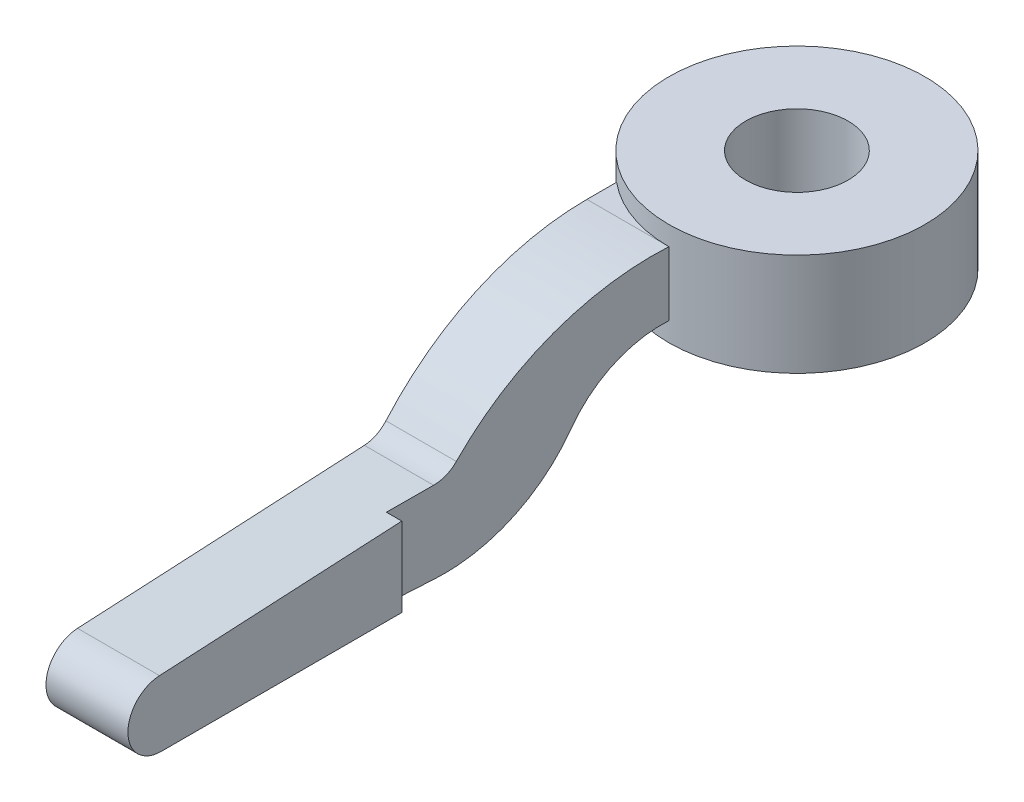
ISO-10303-21;
HEADER;
FILE_DESCRIPTION(('STEP AP214'),'2;1');
FILE_NAME('part.step','',(''),(''),'','','');
FILE_SCHEMA(('AUTOMOTIVE_DESIGN { 1 0 10303 214 1 1 1 1 }'));
ENDSEC;
DATA;
#1=APPLICATION_CONTEXT('core data for automotive mechanical design processes');
#2=APPLICATION_PROTOCOL_DEFINITION('international standard','automotive_design',2000,#1);
#3=PRODUCT_CONTEXT('',#1,'mechanical');
#4=PRODUCT('Part','Part','',(#3));
#5=PRODUCT_RELATED_PRODUCT_CATEGORY('part','',(#4));
#6=PRODUCT_DEFINITION_FORMATION('','',#4);
#7=PRODUCT_DEFINITION_CONTEXT('part definition',#1,'design');
#8=PRODUCT_DEFINITION('design','',#6,#7);
#9=PRODUCT_DEFINITION_SHAPE('','',#8);
#10=(LENGTH_UNIT() NAMED_UNIT(*) SI_UNIT(.MILLI.,.METRE.));
#11=(NAMED_UNIT(*) PLANE_ANGLE_UNIT() SI_UNIT($,.RADIAN.));
#12=(NAMED_UNIT(*) SI_UNIT($,.STERADIAN.) SOLID_ANGLE_UNIT());
#13=UNCERTAINTY_MEASURE_WITH_UNIT(LENGTH_MEASURE(1.E-05),#10,'distance_accuracy_value','');
#14=(GEOMETRIC_REPRESENTATION_CONTEXT(3) GLOBAL_UNCERTAINTY_ASSIGNED_CONTEXT((#13)) GLOBAL_UNIT_ASSIGNED_CONTEXT((#10,
#11,#12)) REPRESENTATION_CONTEXT('',''));
#15=CARTESIAN_POINT('',(0.,0.,0.));
#16=DIRECTION('',(0.,0.,1.));
#17=DIRECTION('',(1.,0.,0.));
#18=AXIS2_PLACEMENT_3D('',#15,#16,#17);
#19=CARTESIAN_POINT('',(0.,2.,0.));
#20=DIRECTION('',(0.,-1.,0.));
#21=DIRECTION('',(0.,0.,-1.));
#22=AXIS2_PLACEMENT_3D('',#19,#20,#21);
#23=CYLINDRICAL_SURFACE('',#22,2.5);
#24=DIRECTION('',(0.,-1.,0.));
#25=VECTOR('',#24,1.);
#26=CARTESIAN_POINT('',(0.,2.,2.5));
#27=LINE('',#26,#25);
#28=CARTESIAN_POINT('',(0.,1.625,2.5));
#29=VERTEX_POINT('',#28);
#30=CARTESIAN_POINT('',(0.,0.375,2.5));
#31=VERTEX_POINT('',#30);
#32=EDGE_CURVE('E190',#29,#31,#27,.T.);
#33=ORIENTED_EDGE('',*,*,#32,.T.);
#34=CARTESIAN_POINT('',(0.,0.375,0.));
#35=DIRECTION('',(0.,1.,0.));
#36=DIRECTION('',(-1.,0.,0.));
#37=AXIS2_PLACEMENT_3D('',#34,#35,#36);
#38=CIRCLE('',#37,2.5);
#39=CARTESIAN_POINT('',(-1.6,0.375,1.92093727122986));
#40=VERTEX_POINT('',#39);
#41=EDGE_CURVE('E195',#40,#31,#38,.T.);
#42=ORIENTED_EDGE('',*,*,#41,.F.);
#43=DIRECTION('',(0.,-1.,0.));
#44=VECTOR('',#43,1.);
#45=CARTESIAN_POINT('',(-1.6,2.,1.92093727122986));
#46=LINE('',#45,#44);
#47=CARTESIAN_POINT('',(-1.6,1.625,1.92093727122986));
#48=VERTEX_POINT('',#47);
#49=EDGE_CURVE('E53',#48,#40,#46,.T.);
#50=ORIENTED_EDGE('',*,*,#49,.F.);
#51=CARTESIAN_POINT('',(0.,1.625,0.));
#52=DIRECTION('',(0.,-1.,0.));
#53=DIRECTION('',(1.,0.,0.));
#54=AXIS2_PLACEMENT_3D('',#51,#52,#53);
#55=CIRCLE('',#54,2.5);
#56=EDGE_CURVE('E61',#29,#48,#55,.T.);
#57=ORIENTED_EDGE('',*,*,#56,.F.);
#58=EDGE_LOOP('',(#33,#42,#50,#57));
#59=FACE_BOUND('',#58,.T.);
#60=CARTESIAN_POINT('',(0.,2.,0.));
#61=DIRECTION('',(0.,1.,0.));
#62=DIRECTION('',(0.,0.,1.));
#63=AXIS2_PLACEMENT_3D('',#60,#61,#62);
#64=CIRCLE('',#63,2.5);
#65=CARTESIAN_POINT('',(0.,2.,2.5));
#66=VERTEX_POINT('',#65);
#67=EDGE_CURVE('E187',#66,#66,#64,.T.);
#68=ORIENTED_EDGE('',*,*,#67,.F.);
#69=EDGE_LOOP('',(#68));
#70=FACE_BOUND('',#69,.T.);
#71=CARTESIAN_POINT('',(0.,0.,0.));
#72=DIRECTION('',(0.,1.,0.));
#73=DIRECTION('',(0.,0.,1.));
#74=AXIS2_PLACEMENT_3D('',#71,#72,#73);
#75=CIRCLE('',#74,2.5);
#76=CARTESIAN_POINT('',(0.,0.,2.5));
#77=VERTEX_POINT('',#76);
#78=EDGE_CURVE('E184',#77,#77,#75,.T.);
#79=ORIENTED_EDGE('',*,*,#78,.T.);
#80=EDGE_LOOP('',(#79));
#81=FACE_BOUND('',#80,.T.);
#82=ADVANCED_FACE('F39',(#59,#70,#81),#23,.T.);
#83=CARTESIAN_POINT('',(0.,2.,0.));
#84=DIRECTION('',(0.,1.,0.));
#85=DIRECTION('',(0.,0.,1.));
#86=AXIS2_PLACEMENT_3D('',#83,#84,#85);
#87=PLANE('',#86);
#88=ORIENTED_EDGE('',*,*,#67,.T.);
#89=EDGE_LOOP('',(#88));
#90=FACE_BOUND('',#89,.T.);
#91=CARTESIAN_POINT('',(0.,2.,0.));
#92=DIRECTION('',(0.,1.,0.));
#93=DIRECTION('',(0.,0.,1.));
#94=AXIS2_PLACEMENT_3D('',#91,#92,#93);
#95=CIRCLE('',#94,1.);
#96=CARTESIAN_POINT('',(0.,2.,1.));
#97=VERTEX_POINT('',#96);
#98=EDGE_CURVE('E181',#97,#97,#95,.T.);
#99=ORIENTED_EDGE('',*,*,#98,.F.);
#100=EDGE_LOOP('',(#99));
#101=FACE_BOUND('',#100,.T.);
#102=ADVANCED_FACE('F260',(#90,#101),#87,.T.);
#103=CARTESIAN_POINT('',(0.,0.,0.));
#104=DIRECTION('',(0.,1.,0.));
#105=DIRECTION('',(0.,0.,1.));
#106=AXIS2_PLACEMENT_3D('',#103,#104,#105);
#107=PLANE('',#106);
#108=ORIENTED_EDGE('',*,*,#78,.F.);
#109=EDGE_LOOP('',(#108));
#110=FACE_BOUND('',#109,.T.);
#111=CARTESIAN_POINT('',(0.,0.,0.));
#112=DIRECTION('',(0.,1.,0.));
#113=DIRECTION('',(0.,0.,1.));
#114=AXIS2_PLACEMENT_3D('',#111,#112,#113);
#115=CIRCLE('',#114,1.);
#116=CARTESIAN_POINT('',(0.,0.,1.));
#117=VERTEX_POINT('',#116);
#118=EDGE_CURVE('E180',#117,#117,#115,.T.);
#119=ORIENTED_EDGE('',*,*,#118,.T.);
#120=EDGE_LOOP('',(#119));
#121=FACE_BOUND('',#120,.T.);
#122=ADVANCED_FACE('F264',(#110,#121),#107,.F.);
#123=CARTESIAN_POINT('',(0.,2.,0.));
#124=DIRECTION('',(0.,-1.,0.));
#125=DIRECTION('',(0.,0.,-1.));
#126=AXIS2_PLACEMENT_3D('',#123,#124,#125);
#127=CYLINDRICAL_SURFACE('',#126,1.);
#128=ORIENTED_EDGE('',*,*,#98,.T.);
#129=EDGE_LOOP('',(#128));
#130=FACE_BOUND('',#129,.T.);
#131=ORIENTED_EDGE('',*,*,#118,.F.);
#132=EDGE_LOOP('',(#131));
#133=FACE_BOUND('',#132,.T.);
#134=ADVANCED_FACE('F270',(#130,#133),#127,.F.);
#135=CARTESIAN_POINT('',(-1.6,-1.77673660529531,2.49999999999999));
#136=DIRECTION('',(1.,0.,0.));
#137=DIRECTION('',(0.,0.,-1.));
#138=AXIS2_PLACEMENT_3D('',#135,#136,#137);
#139=PLANE('',#138);
#140=DIRECTION('',(0.,0.,-1.));
#141=VECTOR('',#140,1.);
#142=CARTESIAN_POINT('',(-1.6,1.625,2.49999999999999));
#143=LINE('',#142,#141);
#144=CARTESIAN_POINT('',(-1.6,1.625,2.49999999999999));
#145=VERTEX_POINT('',#144);
#146=EDGE_CURVE('E208',#145,#48,#143,.T.);
#147=ORIENTED_EDGE('',*,*,#146,.T.);
#148=ORIENTED_EDGE('',*,*,#49,.T.);
#149=DIRECTION('',(0.,0.,1.));
#150=VECTOR('',#149,1.);
#151=CARTESIAN_POINT('',(-1.6,0.375,1.74999999999999));
#152=LINE('',#151,#150);
#153=CARTESIAN_POINT('',(-1.6,0.375,2.49999999999999));
#154=VERTEX_POINT('',#153);
#155=EDGE_CURVE('E154',#40,#154,#152,.T.);
#156=ORIENTED_EDGE('',*,*,#155,.T.);
#157=CARTESIAN_POINT('',(-1.6,-1.77673660529531,2.49999999999999));
#158=DIRECTION('',(1.,0.,0.));
#159=DIRECTION('',(0.,0.,-1.));
#160=AXIS2_PLACEMENT_3D('',#157,#158,#159);
#161=CIRCLE('',#160,2.15173660529531);
#162=CARTESIAN_POINT('',(-1.60000000000001,-0.597766538428562,4.29999999999999));
#163=VERTEX_POINT('',#162);
#164=EDGE_CURVE('E158',#154,#163,#161,.T.);
#165=ORIENTED_EDGE('',*,*,#164,.T.);
#166=CARTESIAN_POINT('',(-1.60000000000001,1.04598028072026,6.80960084366779));
#167=DIRECTION('',(-1.,0.,0.));
#168=DIRECTION('',(0.,0.,1.));
#169=AXIS2_PLACEMENT_3D('',#166,#167,#168);
#170=CIRCLE('',#169,3.);
#171=CARTESIAN_POINT('',(-1.60000000000001,-1.95401971927974,6.80960084366779));
#172=VERTEX_POINT('',#171);
#173=EDGE_CURVE('E228',#163,#172,#170,.T.);
#174=ORIENTED_EDGE('',*,*,#173,.T.);
#175=DIRECTION('',(0.,0.,1.));
#176=VECTOR('',#175,1.);
#177=CARTESIAN_POINT('',(-1.60000000000001,-1.95401971927974,6.80960084366779));
#178=LINE('',#177,#176);
#179=CARTESIAN_POINT('',(-1.60000000000003,-1.95401971927974,12.4096008436678));
#180=VERTEX_POINT('',#179);
#181=EDGE_CURVE('E226',#172,#180,#178,.T.);
#182=ORIENTED_EDGE('',*,*,#181,.T.);
#183=CARTESIAN_POINT('',(-1.60000000000003,-1.30401971927974,12.4096008436678));
#184=DIRECTION('',(-1.,0.,0.));
#185=DIRECTION('',(0.,0.,1.));
#186=AXIS2_PLACEMENT_3D('',#183,#184,#185);
#187=CIRCLE('',#186,0.65);
#188=CARTESIAN_POINT('',(-1.60000000000003,-0.654910521689268,12.4436192152257));
#189=VERTEX_POINT('',#188);
#190=EDGE_CURVE('E224',#180,#189,#187,.T.);
#191=ORIENTED_EDGE('',*,*,#190,.T.);
#192=DIRECTION('',(0.,0.0523359562429373,-0.998629534754574));
#193=VECTOR('',#192,1.);
#194=CARTESIAN_POINT('',(-1.60000000000003,-0.654910521689268,12.4436192152257));
#195=LINE('',#194,#193);
#196=CARTESIAN_POINT('',(-1.60000000000001,-0.361426957704274,6.8436192152257));
#197=VERTEX_POINT('',#196);
#198=EDGE_CURVE('E222',#189,#197,#195,.T.);
#199=ORIENTED_EDGE('',*,*,#198,.T.);
#200=CARTESIAN_POINT('',(-1.60000000000002,0.23775076314847,6.87502078897147));
#201=DIRECTION('',(1.,0.,0.));
#202=DIRECTION('',(0.,0.,-1.));
#203=AXIS2_PLACEMENT_3D('',#200,#201,#202);
#204=CIRCLE('',#203,0.6);
#205=CARTESIAN_POINT('',(-1.60000000000001,-0.157008945622437,6.42317482812739));
#206=VERTEX_POINT('',#205);
#207=EDGE_CURVE('E218',#197,#206,#204,.T.);
#208=ORIENTED_EDGE('',*,*,#207,.T.);
#209=CARTESIAN_POINT('',(-1.6,-3.58452957613958,2.49999999999999));
#210=DIRECTION('',(-1.,0.,0.));
#211=DIRECTION('',(0.,0.,1.));
#212=AXIS2_PLACEMENT_3D('',#209,#210,#211);
#213=CIRCLE('',#212,5.20952957613958);
#214=EDGE_CURVE('E217',#206,#145,#213,.T.);
#215=ORIENTED_EDGE('',*,*,#214,.T.);
#216=EDGE_LOOP('',(#147,#148,#156,#165,#174,#182,#191,#199,#208,#215));
#217=FACE_BOUND('',#216,.T.);
#218=ADVANCED_FACE('F246',(#217),#139,.F.);
#219=CARTESIAN_POINT('',(0.,-1.77673660529531,2.5));
#220=DIRECTION('',(1.,0.,0.));
#221=DIRECTION('',(0.,0.,-1.));
#222=AXIS2_PLACEMENT_3D('',#219,#220,#221);
#223=PLANE('',#222);
#224=DIRECTION('',(0.,-1.,0.));
#225=VECTOR('',#224,1.);
#226=CARTESIAN_POINT('',(0.,2.,7.71372429041861));
#227=LINE('',#226,#225);
#228=CARTESIAN_POINT('',(0.,-0.407027232438032,7.71372429041861));
#229=VERTEX_POINT('',#228);
#230=CARTESIAN_POINT('',(0.,-1.95401971927974,7.71372429041861));
#231=VERTEX_POINT('',#230);
#232=EDGE_CURVE('E123',#229,#231,#227,.T.);
#233=ORIENTED_EDGE('',*,*,#232,.F.);
#234=DIRECTION('',(0.,0.0523359562429373,-0.998629534754574));
#235=VECTOR('',#234,1.);
#236=CARTESIAN_POINT('',(0.,-0.654910521689268,12.4436192152257));
#237=LINE('',#236,#235);
#238=CARTESIAN_POINT('',(0.,-0.654910521689268,12.4436192152257));
#239=VERTEX_POINT('',#238);
#240=EDGE_CURVE('E148',#239,#229,#237,.T.);
#241=ORIENTED_EDGE('',*,*,#240,.F.);
#242=CARTESIAN_POINT('',(0.,-1.30401971927974,12.4096008436678));
#243=DIRECTION('',(-1.,0.,0.));
#244=DIRECTION('',(0.,0.,1.));
#245=AXIS2_PLACEMENT_3D('',#242,#243,#244);
#246=CIRCLE('',#245,0.65);
#247=CARTESIAN_POINT('',(0.,-1.95401971927974,12.4096008436678));
#248=VERTEX_POINT('',#247);
#249=EDGE_CURVE('E145',#248,#239,#246,.T.);
#250=ORIENTED_EDGE('',*,*,#249,.F.);
#251=DIRECTION('',(0.,0.,1.));
#252=VECTOR('',#251,1.);
#253=CARTESIAN_POINT('',(0.,-1.95401971927974,6.8096008436678));
#254=LINE('',#253,#252);
#255=EDGE_CURVE('E140',#231,#248,#254,.T.);
#256=ORIENTED_EDGE('',*,*,#255,.F.);
#257=EDGE_LOOP('',(#233,#241,#250,#256));
#258=FACE_BOUND('',#257,.T.);
#259=ADVANCED_FACE('F144',(#258),#223,.T.);
#260=CARTESIAN_POINT('',(-1.6,-1.77673660529531,2.49999999999999));
#261=DIRECTION('',(1.,0.,0.));
#262=DIRECTION('',(0.,0.,-1.));
#263=AXIS2_PLACEMENT_3D('',#260,#261,#262);
#264=CYLINDRICAL_SURFACE('',#263,2.15173660529531);
#265=DIRECTION('',(1.,0.,0.));
#266=VECTOR('',#265,1.);
#267=CARTESIAN_POINT('',(-1.6,0.375,2.49999999999999));
#268=LINE('',#267,#266);
#269=EDGE_CURVE('E159',#154,#31,#268,.T.);
#270=ORIENTED_EDGE('',*,*,#269,.T.);
#271=CARTESIAN_POINT('',(0.,-1.77673660529531,2.5));
#272=DIRECTION('',(-0.998348648237673,0.,-0.0574454224635017));
#273=DIRECTION('',(0.0574454224635017,0.,-0.998348648237673));
#274=AXIS2_PLACEMENT_3D('',#271,#272,#273);
#275=ELLIPSE('',#274,2.15529575674154,2.15173660529531);
#276=CARTESIAN_POINT('',(-0.103572795552769,-0.597766538428562,4.3));
#277=VERTEX_POINT('',#276);
#278=EDGE_CURVE('E146',#31,#277,#275,.F.);
#279=ORIENTED_EDGE('',*,*,#278,.T.);
#280=DIRECTION('',(1.,0.,0.));
#281=VECTOR('',#280,1.);
#282=CARTESIAN_POINT('',(-1.60000000000001,-0.597766538428562,4.29999999999999));
#283=LINE('',#282,#281);
#284=EDGE_CURVE('E177',#163,#277,#283,.T.);
#285=ORIENTED_EDGE('',*,*,#284,.F.);
#286=ORIENTED_EDGE('',*,*,#164,.F.);
#287=EDGE_LOOP('',(#270,#279,#285,#286));
#288=FACE_BOUND('',#287,.T.);
#289=ADVANCED_FACE('F249',(#288),#264,.F.);
#290=CARTESIAN_POINT('',(-1.60000000000001,1.04598028072026,6.80960084366779));
#291=DIRECTION('',(1.,0.,0.));
#292=DIRECTION('',(0.,0.,-1.));
#293=AXIS2_PLACEMENT_3D('',#290,#291,#292);
#294=CYLINDRICAL_SURFACE('',#293,3.);
#295=ORIENTED_EDGE('',*,*,#284,.T.);
#296=CARTESIAN_POINT('',(-0.247976337275135,1.04598028072026,6.8096008436678));
#297=DIRECTION('',(-0.998348648237673,0.,-0.0574454224635017));
#298=DIRECTION('',(0.0574454224635017,0.,-0.998348648237673));
#299=AXIS2_PLACEMENT_3D('',#296,#297,#298);
#300=ELLIPSE('',#299,3.00496224970678,3.);
#301=CARTESIAN_POINT('',(-0.247976337275134,-1.95401971927974,6.80960084366779));
#302=VERTEX_POINT('',#301);
#303=EDGE_CURVE('E151',#277,#302,#300,.T.);
#304=ORIENTED_EDGE('',*,*,#303,.T.);
#305=DIRECTION('',(1.,0.,0.));
#306=VECTOR('',#305,1.);
#307=CARTESIAN_POINT('',(-1.60000000000001,-1.95401971927974,6.80960084366779));
#308=LINE('',#307,#306);
#309=EDGE_CURVE('E175',#172,#302,#308,.T.);
#310=ORIENTED_EDGE('',*,*,#309,.F.);
#311=ORIENTED_EDGE('',*,*,#173,.F.);
#312=EDGE_LOOP('',(#295,#304,#310,#311));
#313=FACE_BOUND('',#312,.T.);
#314=ADVANCED_FACE('F242',(#313),#294,.T.);
#315=CARTESIAN_POINT('',(-1.60000000000001,-1.95401971927974,6.80960084366779));
#316=DIRECTION('',(0.,1.,0.));
#317=DIRECTION('',(-1.,0.,0.));
#318=AXIS2_PLACEMENT_3D('',#315,#316,#317);
#319=PLANE('',#318);
#320=ORIENTED_EDGE('',*,*,#309,.T.);
#321=DIRECTION('',(0.0574454224635017,0.,-0.998348648237673));
#322=VECTOR('',#321,1.);
#323=CARTESIAN_POINT('',(0.,-1.95401971927974,2.5));
#324=LINE('',#323,#322);
#325=CARTESIAN_POINT('',(-0.300000000000016,-1.95401971927974,7.71372429041861));
#326=VERTEX_POINT('',#325);
#327=EDGE_CURVE('E134',#326,#302,#324,.T.);
#328=ORIENTED_EDGE('',*,*,#327,.F.);
#329=DIRECTION('',(-1.,0.,0.));
#330=VECTOR('',#329,1.);
#331=CARTESIAN_POINT('',(-0.300000000000016,-1.95401971927974,7.71372429041861));
#332=LINE('',#331,#330);
#333=EDGE_CURVE('E127',#231,#326,#332,.T.);
#334=ORIENTED_EDGE('',*,*,#333,.F.);
#335=ORIENTED_EDGE('',*,*,#255,.T.);
#336=DIRECTION('',(1.,0.,0.));
#337=VECTOR('',#336,1.);
#338=CARTESIAN_POINT('',(-1.60000000000003,-1.95401971927974,12.4096008436678));
#339=LINE('',#338,#337);
#340=EDGE_CURVE('E173',#180,#248,#339,.T.);
#341=ORIENTED_EDGE('',*,*,#340,.F.);
#342=ORIENTED_EDGE('',*,*,#181,.F.);
#343=EDGE_LOOP('',(#320,#328,#334,#335,#341,#342));
#344=FACE_BOUND('',#343,.T.);
#345=ADVANCED_FACE('F138',(#344),#319,.F.);
#346=CARTESIAN_POINT('',(-1.60000000000003,-1.30401971927974,12.4096008436678));
#347=DIRECTION('',(1.,0.,0.));
#348=DIRECTION('',(0.,0.,-1.));
#349=AXIS2_PLACEMENT_3D('',#346,#347,#348);
#350=CYLINDRICAL_SURFACE('',#349,0.65);
#351=ORIENTED_EDGE('',*,*,#249,.T.);
#352=DIRECTION('',(1.,0.,0.));
#353=VECTOR('',#352,1.);
#354=CARTESIAN_POINT('',(-1.60000000000003,-0.654910521689268,12.4436192152257));
#355=LINE('',#354,#353);
#356=EDGE_CURVE('E170',#189,#239,#355,.T.);
#357=ORIENTED_EDGE('',*,*,#356,.F.);
#358=ORIENTED_EDGE('',*,*,#190,.F.);
#359=ORIENTED_EDGE('',*,*,#340,.T.);
#360=EDGE_LOOP('',(#351,#357,#358,#359));
#361=FACE_BOUND('',#360,.T.);
#362=ADVANCED_FACE('F301',(#361),#350,.T.);
#363=CARTESIAN_POINT('',(-1.60000000000003,-0.654910521689268,12.4436192152257));
#364=DIRECTION('',(0.,-0.998629534754574,-0.0523359562429373));
#365=DIRECTION('',(0.,0.0523359562429373,-0.998629534754574));
#366=AXIS2_PLACEMENT_3D('',#363,#364,#365);
#367=PLANE('',#366);
#368=DIRECTION('',(-1.,0.,0.));
#369=VECTOR('',#368,1.);
#370=CARTESIAN_POINT('',(-1.60000000000003,-0.407027232438032,7.71372429041861));
#371=LINE('',#370,#369);
#372=CARTESIAN_POINT('',(-0.300000000000016,-0.407027232438032,7.71372429041861));
#373=VERTEX_POINT('',#372);
#374=EDGE_CURVE('E11',#229,#373,#371,.T.);
#375=ORIENTED_EDGE('',*,*,#374,.T.);
#376=DIRECTION('',(0.0573669547735502,0.0522497673077151,-0.996984951900629));
#377=VECTOR('',#376,1.);
#378=CARTESIAN_POINT('',(-0.575542831693532,-0.657991378890043,12.5024054725891));
#379=LINE('',#378,#377);
#380=CARTESIAN_POINT('',(-0.249933769409805,-0.361426957704274,6.84361921522571));
#381=VERTEX_POINT('',#380);
#382=EDGE_CURVE('E233',#373,#381,#379,.T.);
#383=ORIENTED_EDGE('',*,*,#382,.T.);
#384=DIRECTION('',(1.,0.,0.));
#385=VECTOR('',#384,1.);
#386=CARTESIAN_POINT('',(-1.60000000000001,-0.361426957704274,6.8436192152257));
#387=LINE('',#386,#385);
#388=EDGE_CURVE('E167',#197,#381,#387,.T.);
#389=ORIENTED_EDGE('',*,*,#388,.F.);
#390=ORIENTED_EDGE('',*,*,#198,.F.);
#391=ORIENTED_EDGE('',*,*,#356,.T.);
#392=ORIENTED_EDGE('',*,*,#240,.T.);
#393=EDGE_LOOP('',(#375,#383,#389,#390,#391,#392));
#394=FACE_BOUND('',#393,.T.);
#395=ADVANCED_FACE('F297',(#394),#367,.F.);
#396=CARTESIAN_POINT('',(-1.60000000000002,0.23775076314847,6.87502078897147));
#397=DIRECTION('',(1.,0.,0.));
#398=DIRECTION('',(0.,0.,-1.));
#399=AXIS2_PLACEMENT_3D('',#396,#397,#398);
#400=CYLINDRICAL_SURFACE('',#399,0.6);
#401=ORIENTED_EDGE('',*,*,#388,.T.);
#402=CARTESIAN_POINT('',(-0.251740629841807,0.23775076314847,6.87502078897147));
#403=DIRECTION('',(-0.998348648237673,0.,-0.0574454224635017));
#404=DIRECTION('',(0.0574454224635017,0.,-0.998348648237673));
#405=AXIS2_PLACEMENT_3D('',#402,#403,#404);
#406=ELLIPSE('',#405,0.600992449941355,0.6);
#407=CARTESIAN_POINT('',(-0.225741213550781,-0.157008945622436,6.42317482812739));
#408=VERTEX_POINT('',#407);
#409=EDGE_CURVE('E236',#381,#408,#406,.F.);
#410=ORIENTED_EDGE('',*,*,#409,.T.);
#411=DIRECTION('',(1.,0.,0.));
#412=VECTOR('',#411,1.);
#413=CARTESIAN_POINT('',(-1.60000000000001,-0.157008945622437,6.42317482812739));
#414=LINE('',#413,#412);
#415=EDGE_CURVE('E164',#206,#408,#414,.T.);
#416=ORIENTED_EDGE('',*,*,#415,.F.);
#417=ORIENTED_EDGE('',*,*,#207,.F.);
#418=EDGE_LOOP('',(#401,#410,#416,#417));
#419=FACE_BOUND('',#418,.T.);
#420=ADVANCED_FACE('F294',(#419),#400,.F.);
#421=CARTESIAN_POINT('',(-1.6,-3.58452957613958,2.49999999999999));
#422=DIRECTION('',(1.,0.,0.));
#423=DIRECTION('',(0.,0.,-1.));
#424=AXIS2_PLACEMENT_3D('',#421,#422,#423);
#425=CYLINDRICAL_SURFACE('',#424,5.20952957613958);
#426=ORIENTED_EDGE('',*,*,#415,.T.);
#427=CARTESIAN_POINT('',(0.,-3.58452957613958,2.5));
#428=DIRECTION('',(-0.998348648237673,0.,-0.0574454224635017));
#429=DIRECTION('',(0.0574454224635017,0.,-0.998348648237673));
#430=AXIS2_PLACEMENT_3D('',#427,#428,#429);
#431=ELLIPSE('',#430,5.21814657167679,5.20952957613958);
#432=EDGE_CURVE('E46',#408,#29,#431,.T.);
#433=ORIENTED_EDGE('',*,*,#432,.T.);
#434=DIRECTION('',(1.,0.,0.));
#435=VECTOR('',#434,1.);
#436=CARTESIAN_POINT('',(-1.6,1.625,2.49999999999999));
#437=LINE('',#436,#435);
#438=EDGE_CURVE('E162',#145,#29,#437,.T.);
#439=ORIENTED_EDGE('',*,*,#438,.F.);
#440=ORIENTED_EDGE('',*,*,#214,.F.);
#441=EDGE_LOOP('',(#426,#433,#439,#440));
#442=FACE_BOUND('',#441,.T.);
#443=ADVANCED_FACE('F202',(#442),#425,.T.);
#444=CARTESIAN_POINT('',(-1.6,1.625,2.49999999999999));
#445=DIRECTION('',(0.,-1.,0.));
#446=DIRECTION('',(1.,0.,0.));
#447=AXIS2_PLACEMENT_3D('',#444,#445,#446);
#448=PLANE('',#447);
#449=ORIENTED_EDGE('',*,*,#438,.T.);
#450=ORIENTED_EDGE('',*,*,#56,.T.);
#451=ORIENTED_EDGE('',*,*,#146,.F.);
#452=EDGE_LOOP('',(#449,#450,#451));
#453=FACE_BOUND('',#452,.T.);
#454=ADVANCED_FACE('F207',(#453),#448,.F.);
#455=CARTESIAN_POINT('',(-1.6,0.375,1.74999999999999));
#456=DIRECTION('',(0.,1.,0.));
#457=DIRECTION('',(-1.,0.,0.));
#458=AXIS2_PLACEMENT_3D('',#455,#456,#457);
#459=PLANE('',#458);
#460=ORIENTED_EDGE('',*,*,#155,.F.);
#461=ORIENTED_EDGE('',*,*,#41,.T.);
#462=ORIENTED_EDGE('',*,*,#269,.F.);
#463=EDGE_LOOP('',(#460,#461,#462));
#464=FACE_BOUND('',#463,.T.);
#465=ADVANCED_FACE('F214',(#464),#459,.F.);
#466=CARTESIAN_POINT('',(-0.300000000000016,2.,7.71372429041861));
#467=DIRECTION('',(0.,0.,1.));
#468=DIRECTION('',(0.,-1.,0.));
#469=AXIS2_PLACEMENT_3D('',#466,#467,#468);
#470=PLANE('',#469);
#471=ORIENTED_EDGE('',*,*,#232,.T.);
#472=ORIENTED_EDGE('',*,*,#333,.T.);
#473=DIRECTION('',(0.,-1.,0.));
#474=VECTOR('',#473,1.);
#475=CARTESIAN_POINT('',(-0.300000000000016,2.,7.71372429041861));
#476=LINE('',#475,#474);
#477=EDGE_CURVE('E133',#373,#326,#476,.T.);
#478=ORIENTED_EDGE('',*,*,#477,.F.);
#479=ORIENTED_EDGE('',*,*,#374,.F.);
#480=EDGE_LOOP('',(#471,#472,#478,#479));
#481=FACE_BOUND('',#480,.T.);
#482=ADVANCED_FACE('F125',(#481),#470,.F.);
#483=CARTESIAN_POINT('',(0.,2.,2.5));
#484=DIRECTION('',(-0.998348648237673,0.,-0.0574454224635017));
#485=DIRECTION('',(-0.0574454224635017,0.,0.998348648237674));
#486=AXIS2_PLACEMENT_3D('',#483,#484,#485);
#487=PLANE('',#486);
#488=ORIENTED_EDGE('',*,*,#32,.F.);
#489=ORIENTED_EDGE('',*,*,#432,.F.);
#490=ORIENTED_EDGE('',*,*,#409,.F.);
#491=ORIENTED_EDGE('',*,*,#382,.F.);
#492=ORIENTED_EDGE('',*,*,#477,.T.);
#493=ORIENTED_EDGE('',*,*,#327,.T.);
#494=ORIENTED_EDGE('',*,*,#303,.F.);
#495=ORIENTED_EDGE('',*,*,#278,.F.);
#496=EDGE_LOOP('',(#488,#489,#490,#491,#492,#493,#494,#495));
#497=FACE_BOUND('',#496,.T.);
#498=ADVANCED_FACE('F239',(#497),#487,.F.);
#499=CLOSED_SHELL('',(#82,#102,#122,#134,#218,#259,#289,#314,#345,#362,#395,#420,#443,#454,#465,
#482,#498));
#500=MANIFOLD_SOLID_BREP('B2',#499);
#501=ADVANCED_BREP_SHAPE_REPRESENTATION('',(#18,#500),#14);
#502=SHAPE_DEFINITION_REPRESENTATION(#9,#501);
ENDSEC;
END-ISO-10303-21;
